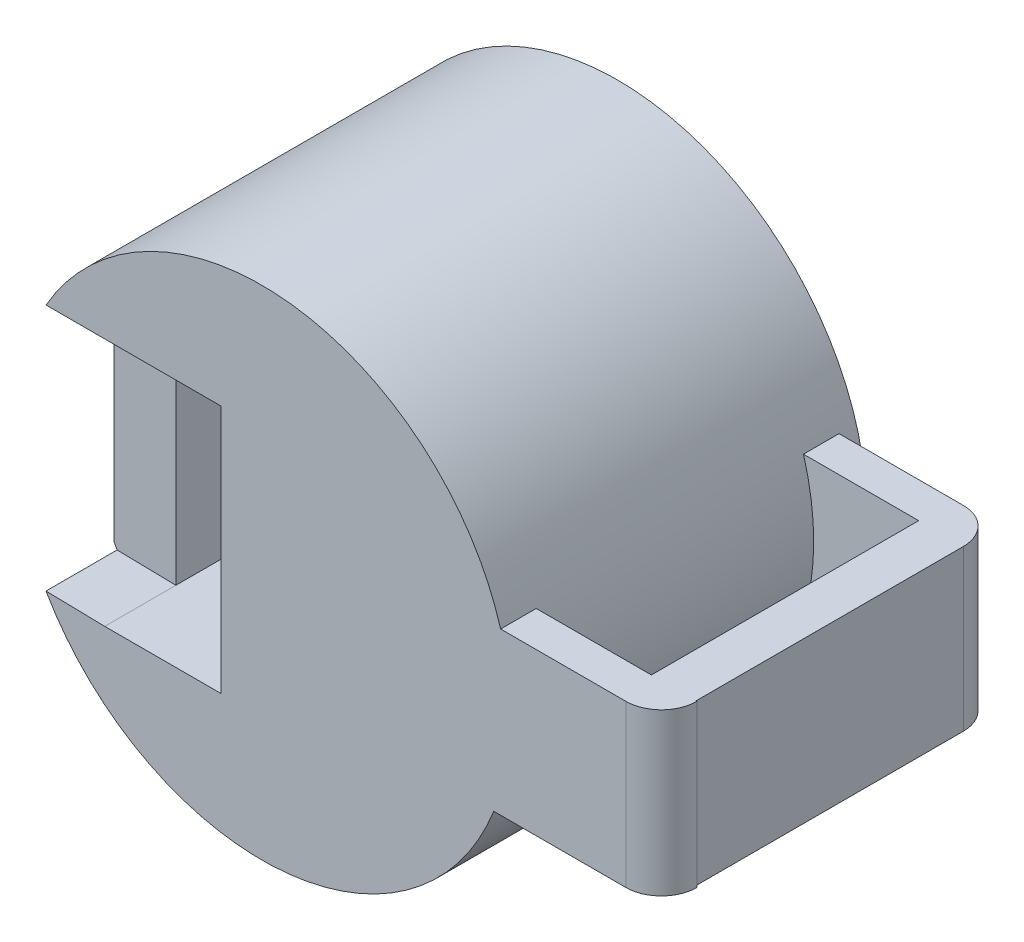
ISO-10303-21;
HEADER;
FILE_DESCRIPTION(('STEP AP214'),'2;1');
FILE_NAME('part.step','',(''),(''),'','','');
FILE_SCHEMA(('AUTOMOTIVE_DESIGN { 1 0 10303 214 1 1 1 1 }'));
ENDSEC;
DATA;
#1=APPLICATION_CONTEXT('core data for automotive mechanical design processes');
#2=APPLICATION_PROTOCOL_DEFINITION('international standard','automotive_design',2000,#1);
#3=PRODUCT_CONTEXT('',#1,'mechanical');
#4=PRODUCT('Part','Part','',(#3));
#5=PRODUCT_RELATED_PRODUCT_CATEGORY('part','',(#4));
#6=PRODUCT_DEFINITION_FORMATION('','',#4);
#7=PRODUCT_DEFINITION_CONTEXT('part definition',#1,'design');
#8=PRODUCT_DEFINITION('design','',#6,#7);
#9=PRODUCT_DEFINITION_SHAPE('','',#8);
#10=(LENGTH_UNIT() NAMED_UNIT(*) SI_UNIT(.MILLI.,.METRE.));
#11=(NAMED_UNIT(*) PLANE_ANGLE_UNIT() SI_UNIT($,.RADIAN.));
#12=(NAMED_UNIT(*) SI_UNIT($,.STERADIAN.) SOLID_ANGLE_UNIT());
#13=UNCERTAINTY_MEASURE_WITH_UNIT(LENGTH_MEASURE(1.E-05),#10,'distance_accuracy_value','');
#14=(GEOMETRIC_REPRESENTATION_CONTEXT(3) GLOBAL_UNCERTAINTY_ASSIGNED_CONTEXT((#13)) GLOBAL_UNIT_ASSIGNED_CONTEXT((#10,
#11,#12)) REPRESENTATION_CONTEXT('',''));
#15=CARTESIAN_POINT('',(0.,0.,0.));
#16=DIRECTION('',(0.,0.,1.));
#17=DIRECTION('',(1.,0.,0.));
#18=AXIS2_PLACEMENT_3D('',#15,#16,#17);
#19=CARTESIAN_POINT('',(-79.6322827842628,6.03259849026327,0.));
#20=DIRECTION('',(-1.,0.,0.));
#21=DIRECTION('',(0.,0.,1.));
#22=AXIS2_PLACEMENT_3D('',#19,#20,#21);
#23=PLANE('',#22);
#24=DIRECTION('',(0.,0.,1.));
#25=VECTOR('',#24,1.);
#26=CARTESIAN_POINT('',(-79.6322827842628,-0.967401509736732,0.));
#27=LINE('',#26,#25);
#28=CARTESIAN_POINT('',(-79.6322827842628,-0.967401509736732,2.));
#29=VERTEX_POINT('',#28);
#30=CARTESIAN_POINT('',(-79.6322827842628,-0.967401509736732,8.));
#31=VERTEX_POINT('',#30);
#32=EDGE_CURVE('E259',#29,#31,#27,.T.);
#33=ORIENTED_EDGE('',*,*,#32,.F.);
#34=DIRECTION('',(0.,-1.,0.));
#35=VECTOR('',#34,1.);
#36=CARTESIAN_POINT('',(-79.6322827842628,-0.967401509736732,2.));
#37=LINE('',#36,#35);
#38=CARTESIAN_POINT('',(-79.6322827842628,6.03259849026327,2.));
#39=VERTEX_POINT('',#38);
#40=EDGE_CURVE('E57',#39,#29,#37,.T.);
#41=ORIENTED_EDGE('',*,*,#40,.F.);
#42=DIRECTION('',(0.,0.,1.));
#43=VECTOR('',#42,1.);
#44=CARTESIAN_POINT('',(-79.6322827842628,6.03259849026327,0.));
#45=LINE('',#44,#43);
#46=CARTESIAN_POINT('',(-79.6322827842628,6.03259849026327,8.));
#47=VERTEX_POINT('',#46);
#48=EDGE_CURVE('E250',#39,#47,#45,.T.);
#49=ORIENTED_EDGE('',*,*,#48,.T.);
#50=DIRECTION('',(0.,1.,0.));
#51=VECTOR('',#50,1.);
#52=CARTESIAN_POINT('',(-79.6322827842628,-0.967401509736732,8.));
#53=LINE('',#52,#51);
#54=EDGE_CURVE('E220',#31,#47,#53,.T.);
#55=ORIENTED_EDGE('',*,*,#54,.F.);
#56=EDGE_LOOP('',(#33,#41,#49,#55));
#57=FACE_BOUND('',#56,.T.);
#58=ADVANCED_FACE('F35',(#57),#23,.F.);
#59=CARTESIAN_POINT('',(-75.2117108329897,2.55000000000001,10.));
#60=DIRECTION('',(0.,0.,1.));
#61=DIRECTION('',(1.,0.,0.));
#62=AXIS2_PLACEMENT_3D('',#59,#60,#61);
#63=PLANE('',#62);
#64=DIRECTION('',(0.999778058097927,-0.0210673810887485,0.));
#65=VECTOR('',#64,1.);
#66=CARTESIAN_POINT('',(-81.2839021800748,-0.932598490263252,10.));
#67=LINE('',#66,#65);
#68=CARTESIAN_POINT('',(-81.2839021800748,-0.932598490263249,10.));
#69=VERTEX_POINT('',#68);
#70=CARTESIAN_POINT('',(-79.6322827842628,-0.967401509736732,10.));
#71=VERTEX_POINT('',#70);
#72=EDGE_CURVE('E218',#69,#71,#67,.T.);
#73=ORIENTED_EDGE('',*,*,#72,.F.);
#74=CARTESIAN_POINT('',(-75.2117108329897,2.55000000000001,10.));
#75=DIRECTION('',(0.,0.,1.));
#76=DIRECTION('',(1.,0.,0.));
#77=AXIS2_PLACEMENT_3D('',#74,#75,#76);
#78=CIRCLE('',#77,7.);
#79=CARTESIAN_POINT('',(-68.692700171854,0.,10.));
#80=VERTEX_POINT('',#79);
#81=EDGE_CURVE('E327',#69,#80,#78,.T.);
#82=ORIENTED_EDGE('',*,*,#81,.T.);
#83=DIRECTION('',(1.,0.,0.));
#84=VECTOR('',#83,1.);
#85=CARTESIAN_POINT('',(-63.9777348239475,0.,10.));
#86=LINE('',#85,#84);
#87=CARTESIAN_POINT('',(-64.9777348239475,0.,10.));
#88=VERTEX_POINT('',#87);
#89=EDGE_CURVE('E303',#80,#88,#86,.T.);
#90=ORIENTED_EDGE('',*,*,#89,.T.);
#91=DIRECTION('',(0.,1.,0.));
#92=VECTOR('',#91,1.);
#93=CARTESIAN_POINT('',(-64.9777348239475,4.534999237552,10.));
#94=LINE('',#93,#92);
#95=CARTESIAN_POINT('',(-64.9777348239475,4.534999237552,10.));
#96=VERTEX_POINT('',#95);
#97=EDGE_CURVE('E361',#88,#96,#94,.T.);
#98=ORIENTED_EDGE('',*,*,#97,.T.);
#99=DIRECTION('',(-1.,0.,0.));
#100=VECTOR('',#99,1.);
#101=CARTESIAN_POINT('',(-69.5931377068921,4.534999237552,10.));
#102=LINE('',#101,#100);
#103=CARTESIAN_POINT('',(-68.4990527881524,4.534999237552,10.));
#104=VERTEX_POINT('',#103);
#105=EDGE_CURVE('E306',#96,#104,#102,.T.);
#106=ORIENTED_EDGE('',*,*,#105,.T.);
#107=CARTESIAN_POINT('',(-81.2839021800748,6.03259849026327,10.));
#108=VERTEX_POINT('',#107);
#109=EDGE_CURVE('E323',#104,#108,#78,.T.);
#110=ORIENTED_EDGE('',*,*,#109,.T.);
#111=DIRECTION('',(1.,0.,0.));
#112=VECTOR('',#111,1.);
#113=CARTESIAN_POINT('',(-79.6322827842628,6.03259849026327,10.));
#114=LINE('',#113,#112);
#115=CARTESIAN_POINT('',(-76.3656360571261,6.03259849026327,10.));
#116=VERTEX_POINT('',#115);
#117=EDGE_CURVE('E237',#108,#116,#114,.T.);
#118=ORIENTED_EDGE('',*,*,#117,.T.);
#119=DIRECTION('',(0.,-1.,0.));
#120=VECTOR('',#119,1.);
#121=CARTESIAN_POINT('',(-76.3656360571261,6.03259849026327,10.));
#122=LINE('',#121,#120);
#123=CARTESIAN_POINT('',(-76.3656360571261,-0.967401509736732,10.));
#124=VERTEX_POINT('',#123);
#125=EDGE_CURVE('E253',#116,#124,#122,.T.);
#126=ORIENTED_EDGE('',*,*,#125,.T.);
#127=DIRECTION('',(1.,0.,0.));
#128=VECTOR('',#127,1.);
#129=CARTESIAN_POINT('',(-79.6322827842628,-0.967401509736732,10.));
#130=LINE('',#129,#128);
#131=EDGE_CURVE('E245',#71,#124,#130,.T.);
#132=ORIENTED_EDGE('',*,*,#131,.F.);
#133=EDGE_LOOP('',(#73,#82,#90,#98,#106,#110,#118,#126,#132));
#134=FACE_BOUND('',#133,.T.);
#135=ADVANCED_FACE('F375',(#134),#63,.T.);
#136=CARTESIAN_POINT('',(-75.2117108329897,2.55000000000001,0.));
#137=DIRECTION('',(0.,0.,1.));
#138=DIRECTION('',(1.,0.,0.));
#139=AXIS2_PLACEMENT_3D('',#136,#137,#138);
#140=PLANE('',#139);
#141=DIRECTION('',(1.,0.,0.));
#142=VECTOR('',#141,1.);
#143=CARTESIAN_POINT('',(-79.6322827842628,6.03259849026327,0.));
#144=LINE('',#143,#142);
#145=CARTESIAN_POINT('',(-81.2839021800748,6.03259849026327,0.));
#146=VERTEX_POINT('',#145);
#147=CARTESIAN_POINT('',(-76.3656360571261,6.03259849026327,0.));
#148=VERTEX_POINT('',#147);
#149=EDGE_CURVE('E242',#146,#148,#144,.T.);
#150=ORIENTED_EDGE('',*,*,#149,.F.);
#151=CARTESIAN_POINT('',(-75.2117108329897,2.55000000000001,0.));
#152=DIRECTION('',(0.,0.,1.));
#153=DIRECTION('',(1.,0.,0.));
#154=AXIS2_PLACEMENT_3D('',#151,#152,#153);
#155=CIRCLE('',#154,7.);
#156=CARTESIAN_POINT('',(-81.2839021800748,-0.932598490263241,0.));
#157=VERTEX_POINT('',#156);
#158=EDGE_CURVE('E322',#157,#146,#155,.T.);
#159=ORIENTED_EDGE('',*,*,#158,.F.);
#160=DIRECTION('',(-0.999778058097927,0.0210673810887533,0.));
#161=VECTOR('',#160,1.);
#162=CARTESIAN_POINT('',(-81.2839021800748,-0.932598490263243,0.));
#163=LINE('',#162,#161);
#164=CARTESIAN_POINT('',(-79.6322827842628,-0.967401509736732,0.));
#165=VERTEX_POINT('',#164);
#166=EDGE_CURVE('E202',#165,#157,#163,.T.);
#167=ORIENTED_EDGE('',*,*,#166,.F.);
#168=DIRECTION('',(1.,0.,0.));
#169=VECTOR('',#168,1.);
#170=CARTESIAN_POINT('',(-79.6322827842628,-0.967401509736732,0.));
#171=LINE('',#170,#169);
#172=CARTESIAN_POINT('',(-76.3656360571261,-0.967401509736732,0.));
#173=VERTEX_POINT('',#172);
#174=EDGE_CURVE('E247',#165,#173,#171,.T.);
#175=ORIENTED_EDGE('',*,*,#174,.T.);
#176=DIRECTION('',(0.,-1.,0.));
#177=VECTOR('',#176,1.);
#178=CARTESIAN_POINT('',(-76.3656360571261,6.03259849026327,0.));
#179=LINE('',#178,#177);
#180=EDGE_CURVE('E244',#148,#173,#179,.T.);
#181=ORIENTED_EDGE('',*,*,#180,.F.);
#182=EDGE_LOOP('',(#150,#159,#167,#175,#181));
#183=FACE_BOUND('',#182,.T.);
#184=ADVANCED_FACE('F427',(#183),#140,.F.);
#185=CARTESIAN_POINT('',(-65.2601105072329,0.,0.));
#186=DIRECTION('',(1.,0.,0.));
#187=DIRECTION('',(0.,0.,-1.));
#188=AXIS2_PLACEMENT_3D('',#185,#186,#187);
#189=PLANE('',#188);
#190=DIRECTION('',(0.,-1.,0.));
#191=VECTOR('',#190,1.);
#192=CARTESIAN_POINT('',(-65.2601105072329,4.534999237552,0.484260169593148));
#193=LINE('',#192,#191);
#194=CARTESIAN_POINT('',(-65.2601105072329,0.0349992375519997,0.484260169593148));
#195=VERTEX_POINT('',#194);
#196=CARTESIAN_POINT('',(-65.2601105072329,0.,0.484260169593148));
#197=VERTEX_POINT('',#196);
#198=EDGE_CURVE('E279',#195,#197,#193,.T.);
#199=ORIENTED_EDGE('',*,*,#198,.F.);
#200=DIRECTION('',(0.,0.,1.));
#201=VECTOR('',#200,1.);
#202=CARTESIAN_POINT('',(-65.2601105072329,0.0349992375519997,0.484260169593148));
#203=LINE('',#202,#201);
#204=CARTESIAN_POINT('',(-65.2601105072329,0.0349992375519997,1.48364750860179));
#205=VERTEX_POINT('',#204);
#206=EDGE_CURVE('E276',#195,#205,#203,.T.);
#207=ORIENTED_EDGE('',*,*,#206,.T.);
#208=DIRECTION('',(0.,0.0349992375519997,0.999387339008644));
#209=VECTOR('',#208,1.);
#210=CARTESIAN_POINT('',(-65.2601105072329,0.0349992375519997,1.48364750860179));
#211=LINE('',#210,#209);
#212=EDGE_CURVE('E284',#197,#205,#211,.T.);
#213=ORIENTED_EDGE('',*,*,#212,.F.);
#214=EDGE_LOOP('',(#199,#207,#213));
#215=FACE_BOUND('',#214,.T.);
#216=ADVANCED_FACE('F469',(#215),#189,.T.);
#217=CARTESIAN_POINT('',(-75.2117108329897,2.55000000000001,10.));
#218=DIRECTION('',(0.,0.,-1.));
#219=DIRECTION('',(-1.,0.,0.));
#220=AXIS2_PLACEMENT_3D('',#217,#218,#219);
#221=CYLINDRICAL_SURFACE('',#220,7.);
#222=CARTESIAN_POINT('',(-75.2117108329897,2.55000000000001,8.));
#223=DIRECTION('',(0.,0.,1.));
#224=DIRECTION('',(1.,0.,0.));
#225=AXIS2_PLACEMENT_3D('',#222,#223,#224);
#226=CIRCLE('',#225,6.99999999999998);
#227=CARTESIAN_POINT('',(-81.3656360571261,-0.786046213069779,8.));
#228=VERTEX_POINT('',#227);
#229=CARTESIAN_POINT('',(-81.2839021800748,-0.932598490263249,8.));
#230=VERTEX_POINT('',#229);
#231=EDGE_CURVE('E201',#228,#230,#226,.T.);
#232=ORIENTED_EDGE('',*,*,#231,.F.);
#233=DIRECTION('',(0.,0.,-1.));
#234=VECTOR('',#233,1.);
#235=CARTESIAN_POINT('',(-81.3656360571261,-0.786046213069784,10.));
#236=LINE('',#235,#234);
#237=CARTESIAN_POINT('',(-81.3656360571261,-0.786046213069791,2.));
#238=VERTEX_POINT('',#237);
#239=EDGE_CURVE('E189',#228,#238,#236,.T.);
#240=ORIENTED_EDGE('',*,*,#239,.T.);
#241=CARTESIAN_POINT('',(-75.2117108329895,2.55000000000001,2.));
#242=DIRECTION('',(0.,0.,-1.));
#243=DIRECTION('',(1.,0.,0.));
#244=AXIS2_PLACEMENT_3D('',#241,#242,#243);
#245=CIRCLE('',#244,7.00000000000013);
#246=CARTESIAN_POINT('',(-81.2839021800748,-0.932598490263241,2.));
#247=VERTEX_POINT('',#246);
#248=EDGE_CURVE('E199',#247,#238,#245,.T.);
#249=ORIENTED_EDGE('',*,*,#248,.F.);
#250=DIRECTION('',(0.,0.,-1.));
#251=VECTOR('',#250,1.);
#252=CARTESIAN_POINT('',(-81.2839021800748,-0.932598490263241,2.));
#253=LINE('',#252,#251);
#254=EDGE_CURVE('E209',#247,#157,#253,.T.);
#255=ORIENTED_EDGE('',*,*,#254,.T.);
#256=ORIENTED_EDGE('',*,*,#158,.T.);
#257=DIRECTION('',(0.,0.,-1.));
#258=VECTOR('',#257,1.);
#259=CARTESIAN_POINT('',(-81.2839021800748,6.03259849026327,2.));
#260=LINE('',#259,#258);
#261=CARTESIAN_POINT('',(-81.2839021800748,6.03259849026327,2.));
#262=VERTEX_POINT('',#261);
#263=EDGE_CURVE('E215',#262,#146,#260,.T.);
#264=ORIENTED_EDGE('',*,*,#263,.F.);
#265=CARTESIAN_POINT('',(-81.3656360571261,5.88604621306982,2.));
#266=VERTEX_POINT('',#265);
#267=EDGE_CURVE('E207',#266,#262,#245,.T.);
#268=ORIENTED_EDGE('',*,*,#267,.F.);
#269=DIRECTION('',(0.,0.,-1.));
#270=VECTOR('',#269,1.);
#271=CARTESIAN_POINT('',(-81.3656360571261,5.88604621306981,10.));
#272=LINE('',#271,#270);
#273=CARTESIAN_POINT('',(-81.3656360571261,5.8860462130698,8.));
#274=VERTEX_POINT('',#273);
#275=EDGE_CURVE('E50',#266,#274,#272,.F.);
#276=ORIENTED_EDGE('',*,*,#275,.T.);
#277=CARTESIAN_POINT('',(-81.2839021800748,6.03259849026327,8.));
#278=VERTEX_POINT('',#277);
#279=EDGE_CURVE('E226',#278,#274,#226,.T.);
#280=ORIENTED_EDGE('',*,*,#279,.F.);
#281=DIRECTION('',(0.,0.,1.));
#282=VECTOR('',#281,1.);
#283=CARTESIAN_POINT('',(-81.2839021800748,6.03259849026327,8.));
#284=LINE('',#283,#282);
#285=EDGE_CURVE('E232',#278,#108,#284,.T.);
#286=ORIENTED_EDGE('',*,*,#285,.T.);
#287=ORIENTED_EDGE('',*,*,#109,.F.);
#288=DIRECTION('',(0.,0.,-1.));
#289=VECTOR('',#288,1.);
#290=CARTESIAN_POINT('',(-68.4990527881524,4.534999237552,10.));
#291=LINE('',#290,#289);
#292=CARTESIAN_POINT('',(-68.4990527881524,4.534999237552,9.));
#293=VERTEX_POINT('',#292);
#294=EDGE_CURVE('E309',#293,#104,#291,.F.);
#295=ORIENTED_EDGE('',*,*,#294,.F.);
#296=CARTESIAN_POINT('',(-75.2117108329897,2.55000000000001,9.));
#297=DIRECTION('',(0.,0.,-1.));
#298=DIRECTION('',(-1.,0.,0.));
#299=AXIS2_PLACEMENT_3D('',#296,#297,#298);
#300=CIRCLE('',#299,7.);
#301=CARTESIAN_POINT('',(-68.692700171854,0.,9.));
#302=VERTEX_POINT('',#301);
#303=EDGE_CURVE('E326',#293,#302,#300,.T.);
#304=ORIENTED_EDGE('',*,*,#303,.T.);
#305=DIRECTION('',(0.,0.,-1.));
#306=VECTOR('',#305,1.);
#307=CARTESIAN_POINT('',(-68.692700171854,0.,10.));
#308=LINE('',#307,#306);
#309=EDGE_CURVE('E319',#80,#302,#308,.T.);
#310=ORIENTED_EDGE('',*,*,#309,.F.);
#311=ORIENTED_EDGE('',*,*,#81,.F.);
#312=DIRECTION('',(0.,0.,1.));
#313=VECTOR('',#312,1.);
#314=CARTESIAN_POINT('',(-81.2839021800748,-0.932598490263249,8.));
#315=LINE('',#314,#313);
#316=EDGE_CURVE('E238',#230,#69,#315,.T.);
#317=ORIENTED_EDGE('',*,*,#316,.F.);
#318=EDGE_LOOP('',(#232,#240,#249,#255,#256,#264,#268,#276,#280,#286,#287,#295,#304,#310,#311,#317));
#319=FACE_BOUND('',#318,.T.);
#320=DIRECTION('',(0.,0.,-1.));
#321=VECTOR('',#320,1.);
#322=CARTESIAN_POINT('',(-68.4990527881524,4.534999237552,10.));
#323=LINE('',#322,#321);
#324=CARTESIAN_POINT('',(-68.4990527881524,4.534999237552,0.484260169593147));
#325=VERTEX_POINT('',#324);
#326=CARTESIAN_POINT('',(-68.4990527881524,4.534999237552,1.48364750860179));
#327=VERTEX_POINT('',#326);
#328=EDGE_CURVE('E341',#325,#327,#323,.F.);
#329=ORIENTED_EDGE('',*,*,#328,.F.);
#330=CARTESIAN_POINT('',(-75.2117108329897,2.55000000000001,0.484260169593147));
#331=DIRECTION('',(0.,0.,1.));
#332=DIRECTION('',(1.,0.,0.));
#333=AXIS2_PLACEMENT_3D('',#330,#331,#332);
#334=CIRCLE('',#333,7.);
#335=CARTESIAN_POINT('',(-68.692700171854,0.,0.484260169593148));
#336=VERTEX_POINT('',#335);
#337=EDGE_CURVE('E338',#336,#325,#334,.T.);
#338=ORIENTED_EDGE('',*,*,#337,.F.);
#339=CARTESIAN_POINT('',(-75.2117108329897,2.55000000000001,73.2983524961972));
#340=DIRECTION('',(0.,0.999387339008644,-0.0349992375519997));
#341=DIRECTION('',(0.,-0.0349992375519997,-0.999387339008644));
#342=AXIS2_PLACEMENT_3D('',#339,#340,#341);
#343=ELLIPSE('',#342,200.004356940629,7.);
#344=CARTESIAN_POINT('',(-68.6791178436105,0.0349992375519997,1.48364750860179));
#345=VERTEX_POINT('',#344);
#346=EDGE_CURVE('E335',#345,#336,#343,.T.);
#347=ORIENTED_EDGE('',*,*,#346,.F.);
#348=CARTESIAN_POINT('',(-75.2117108329897,2.55000000000001,1.48364750860179));
#349=DIRECTION('',(0.,0.,-1.));
#350=DIRECTION('',(0.,1.,0.));
#351=AXIS2_PLACEMENT_3D('',#348,#349,#350);
#352=CIRCLE('',#351,7.);
#353=EDGE_CURVE('E332',#327,#345,#352,.T.);
#354=ORIENTED_EDGE('',*,*,#353,.F.);
#355=EDGE_LOOP('',(#329,#338,#347,#354));
#356=FACE_BOUND('',#355,.T.);
#357=ADVANCED_FACE('F196',(#319,#356),#221,.T.);
#358=CARTESIAN_POINT('',(-63.9777348239475,0.,10.));
#359=DIRECTION('',(0.,1.,0.));
#360=DIRECTION('',(0.,0.,1.));
#361=AXIS2_PLACEMENT_3D('',#358,#359,#360);
#362=PLANE('',#361);
#363=DIRECTION('',(1.,0.,0.));
#364=VECTOR('',#363,1.);
#365=CARTESIAN_POINT('',(-63.9777348239475,0.,9.));
#366=LINE('',#365,#364);
#367=CARTESIAN_POINT('',(-63.9777348239475,0.,9.));
#368=VERTEX_POINT('',#367);
#369=EDGE_CURVE('E302',#302,#368,#366,.T.);
#370=ORIENTED_EDGE('',*,*,#369,.T.);
#371=CARTESIAN_POINT('',(-64.9777348239475,0.,9.));
#372=DIRECTION('',(0.,1.,0.));
#373=DIRECTION('',(0.,0.,1.));
#374=AXIS2_PLACEMENT_3D('',#371,#372,#373);
#375=CIRCLE('',#374,1.);
#376=EDGE_CURVE('E43',#368,#88,#375,.F.);
#377=ORIENTED_EDGE('',*,*,#376,.T.);
#378=ORIENTED_EDGE('',*,*,#89,.F.);
#379=ORIENTED_EDGE('',*,*,#309,.T.);
#380=EDGE_LOOP('',(#370,#377,#378,#379));
#381=FACE_BOUND('',#380,.T.);
#382=ADVANCED_FACE('F368',(#381),#362,.F.);
#383=CARTESIAN_POINT('',(-69.5931377068921,4.534999237552,10.));
#384=DIRECTION('',(0.,-1.,0.));
#385=DIRECTION('',(0.,0.,-1.));
#386=AXIS2_PLACEMENT_3D('',#383,#384,#385);
#387=PLANE('',#386);
#388=ORIENTED_EDGE('',*,*,#105,.F.);
#389=CARTESIAN_POINT('',(-64.9777348239475,4.534999237552,9.));
#390=DIRECTION('',(0.,-1.,0.));
#391=DIRECTION('',(0.,0.,-1.));
#392=AXIS2_PLACEMENT_3D('',#389,#390,#391);
#393=CIRCLE('',#392,1.);
#394=CARTESIAN_POINT('',(-63.9777348239475,4.534999237552,9.));
#395=VERTEX_POINT('',#394);
#396=EDGE_CURVE('E364',#96,#395,#393,.F.);
#397=ORIENTED_EDGE('',*,*,#396,.T.);
#398=DIRECTION('',(-1.,0.,0.));
#399=VECTOR('',#398,1.);
#400=CARTESIAN_POINT('',(-69.5931377068921,4.534999237552,9.));
#401=LINE('',#400,#399);
#402=CARTESIAN_POINT('',(-64.0024569689168,4.534999237552,9.));
#403=VERTEX_POINT('',#402);
#404=EDGE_CURVE('E307',#395,#403,#401,.T.);
#405=ORIENTED_EDGE('',*,*,#404,.T.);
#406=DIRECTION('',(0.,0.,-1.));
#407=VECTOR('',#406,1.);
#408=CARTESIAN_POINT('',(-64.0024569689168,4.534999237552,9.48426016959315));
#409=LINE('',#408,#407);
#410=CARTESIAN_POINT('',(-64.0024569689168,4.534999237552,1.48426016959315));
#411=VERTEX_POINT('',#410);
#412=EDGE_CURVE('E268',#403,#411,#409,.T.);
#413=ORIENTED_EDGE('',*,*,#412,.T.);
#414=CARTESIAN_POINT('',(-65.0024569689168,4.534999237552,1.48426016959315));
#415=DIRECTION('',(0.,-1.,0.));
#416=DIRECTION('',(0.,0.,-1.));
#417=AXIS2_PLACEMENT_3D('',#414,#415,#416);
#418=CIRCLE('',#417,1.);
#419=CARTESIAN_POINT('',(-65.0024569689168,4.534999237552,0.484260169593148));
#420=VERTEX_POINT('',#419);
#421=EDGE_CURVE('E355',#411,#420,#418,.F.);
#422=ORIENTED_EDGE('',*,*,#421,.T.);
#423=DIRECTION('',(1.,0.,0.));
#424=VECTOR('',#423,1.);
#425=CARTESIAN_POINT('',(-71.2601105072329,4.534999237552,0.484260169593148));
#426=LINE('',#425,#424);
#427=EDGE_CURVE('E299',#325,#420,#426,.T.);
#428=ORIENTED_EDGE('',*,*,#427,.F.);
#429=ORIENTED_EDGE('',*,*,#328,.T.);
#430=DIRECTION('',(1.,0.,0.));
#431=VECTOR('',#430,1.);
#432=CARTESIAN_POINT('',(-71.2601105072329,4.534999237552,1.48364750860179));
#433=LINE('',#432,#431);
#434=CARTESIAN_POINT('',(-65.2601105072329,4.534999237552,1.48364750860179));
#435=VERTEX_POINT('',#434);
#436=EDGE_CURVE('E290',#327,#435,#433,.T.);
#437=ORIENTED_EDGE('',*,*,#436,.T.);
#438=DIRECTION('',(0.,0.,1.));
#439=VECTOR('',#438,1.);
#440=CARTESIAN_POINT('',(-65.2601105072329,4.534999237552,0.484260169593148));
#441=LINE('',#440,#439);
#442=CARTESIAN_POINT('',(-65.2601105072329,4.534999237552,9.));
#443=VERTEX_POINT('',#442);
#444=EDGE_CURVE('E273',#435,#443,#441,.T.);
#445=ORIENTED_EDGE('',*,*,#444,.T.);
#446=EDGE_CURVE('E314',#443,#293,#401,.T.);
#447=ORIENTED_EDGE('',*,*,#446,.T.);
#448=ORIENTED_EDGE('',*,*,#294,.T.);
#449=EDGE_LOOP('',(#388,#397,#405,#413,#422,#428,#429,#437,#445,#447,#448));
#450=FACE_BOUND('',#449,.T.);
#451=ADVANCED_FACE('F380',(#450),#387,.F.);
#452=CARTESIAN_POINT('',(0.,0.,9.));
#453=DIRECTION('',(0.,0.,-1.));
#454=DIRECTION('',(-1.,0.,0.));
#455=AXIS2_PLACEMENT_3D('',#452,#453,#454);
#456=PLANE('',#455);
#457=DIRECTION('',(0.,1.,0.));
#458=VECTOR('',#457,1.);
#459=CARTESIAN_POINT('',(-65.2601105072329,0.,9.));
#460=LINE('',#459,#458);
#461=CARTESIAN_POINT('',(-65.2601105072329,0.0349992375519997,9.));
#462=VERTEX_POINT('',#461);
#463=EDGE_CURVE('E349',#462,#443,#460,.T.);
#464=ORIENTED_EDGE('',*,*,#463,.F.);
#465=DIRECTION('',(1.,0.,0.));
#466=VECTOR('',#465,1.);
#467=CARTESIAN_POINT('',(0.,0.0349992375519997,9.));
#468=LINE('',#467,#466);
#469=CARTESIAN_POINT('',(-64.0024569689168,0.0349992375519997,9.));
#470=VERTEX_POINT('',#469);
#471=EDGE_CURVE('E344',#462,#470,#468,.T.);
#472=ORIENTED_EDGE('',*,*,#471,.T.);
#473=DIRECTION('',(0.,-1.,0.));
#474=VECTOR('',#473,1.);
#475=CARTESIAN_POINT('',(-64.0024569689168,0.,9.));
#476=LINE('',#475,#474);
#477=EDGE_CURVE('E347',#403,#470,#476,.T.);
#478=ORIENTED_EDGE('',*,*,#477,.F.);
#479=ORIENTED_EDGE('',*,*,#404,.F.);
#480=DIRECTION('',(0.,1.,0.));
#481=VECTOR('',#480,1.);
#482=CARTESIAN_POINT('',(-63.9777348239475,4.534999237552,9.));
#483=LINE('',#482,#481);
#484=EDGE_CURVE('E311',#368,#395,#483,.T.);
#485=ORIENTED_EDGE('',*,*,#484,.F.);
#486=ORIENTED_EDGE('',*,*,#369,.F.);
#487=ORIENTED_EDGE('',*,*,#303,.F.);
#488=ORIENTED_EDGE('',*,*,#446,.F.);
#489=EDGE_LOOP('',(#464,#472,#478,#479,#485,#486,#487,#488));
#490=FACE_BOUND('',#489,.T.);
#491=ADVANCED_FACE('F384',(#490),#456,.T.);
#492=CARTESIAN_POINT('',(-71.2601105072329,4.534999237552,0.484260169593148));
#493=DIRECTION('',(0.,0.,1.));
#494=DIRECTION('',(1.,0.,0.));
#495=AXIS2_PLACEMENT_3D('',#492,#493,#494);
#496=PLANE('',#495);
#497=ORIENTED_EDGE('',*,*,#427,.T.);
#498=DIRECTION('',(0.,1.,0.));
#499=VECTOR('',#498,1.);
#500=CARTESIAN_POINT('',(-65.0024569689168,0.0349992375519997,0.484260169593148));
#501=LINE('',#500,#499);
#502=CARTESIAN_POINT('',(-65.0024569689168,0.0349992375519997,0.484260169593148));
#503=VERTEX_POINT('',#502);
#504=EDGE_CURVE('E357',#420,#503,#501,.F.);
#505=ORIENTED_EDGE('',*,*,#504,.T.);
#506=DIRECTION('',(-1.,0.,0.));
#507=VECTOR('',#506,1.);
#508=CARTESIAN_POINT('',(-64.0024569689168,0.0349992375519997,0.484260169593148));
#509=LINE('',#508,#507);
#510=EDGE_CURVE('E272',#503,#195,#509,.T.);
#511=ORIENTED_EDGE('',*,*,#510,.T.);
#512=ORIENTED_EDGE('',*,*,#198,.T.);
#513=DIRECTION('',(1.,0.,0.));
#514=VECTOR('',#513,1.);
#515=CARTESIAN_POINT('',(-71.2601105072329,0.,0.484260169593148));
#516=LINE('',#515,#514);
#517=EDGE_CURVE('E296',#336,#197,#516,.T.);
#518=ORIENTED_EDGE('',*,*,#517,.F.);
#519=ORIENTED_EDGE('',*,*,#337,.T.);
#520=EDGE_LOOP('',(#497,#505,#511,#512,#518,#519));
#521=FACE_BOUND('',#520,.T.);
#522=ADVANCED_FACE('F400',(#521),#496,.F.);
#523=CARTESIAN_POINT('',(-71.2601105072329,0.0349992375519997,1.48364750860179));
#524=DIRECTION('',(0.,0.999387339008644,-0.0349992375519997));
#525=DIRECTION('',(0.,0.0349992375519997,0.999387339008644));
#526=AXIS2_PLACEMENT_3D('',#523,#524,#525);
#527=PLANE('',#526);
#528=DIRECTION('',(1.,0.,0.));
#529=VECTOR('',#528,1.);
#530=CARTESIAN_POINT('',(-71.2601105072329,0.0349992375519997,1.48364750860179));
#531=LINE('',#530,#529);
#532=EDGE_CURVE('E293',#345,#205,#531,.T.);
#533=ORIENTED_EDGE('',*,*,#532,.F.);
#534=ORIENTED_EDGE('',*,*,#346,.T.);
#535=ORIENTED_EDGE('',*,*,#517,.T.);
#536=ORIENTED_EDGE('',*,*,#212,.T.);
#537=EDGE_LOOP('',(#533,#534,#535,#536));
#538=FACE_BOUND('',#537,.T.);
#539=ADVANCED_FACE('F404',(#538),#527,.F.);
#540=CARTESIAN_POINT('',(-71.2601105072329,4.534999237552,1.48364750860179));
#541=DIRECTION('',(0.,0.,-1.));
#542=DIRECTION('',(0.,1.,0.));
#543=AXIS2_PLACEMENT_3D('',#540,#541,#542);
#544=PLANE('',#543);
#545=ORIENTED_EDGE('',*,*,#436,.F.);
#546=ORIENTED_EDGE('',*,*,#353,.T.);
#547=ORIENTED_EDGE('',*,*,#532,.T.);
#548=DIRECTION('',(0.,1.,0.));
#549=VECTOR('',#548,1.);
#550=CARTESIAN_POINT('',(-65.2601105072329,4.534999237552,1.48364750860179));
#551=LINE('',#550,#549);
#552=EDGE_CURVE('E287',#205,#435,#551,.T.);
#553=ORIENTED_EDGE('',*,*,#552,.T.);
#554=EDGE_LOOP('',(#545,#546,#547,#553));
#555=FACE_BOUND('',#554,.T.);
#556=ADVANCED_FACE('F408',(#555),#544,.F.);
#557=CARTESIAN_POINT('',(-65.2601105072329,0.0349992375519997,0.484260169593148));
#558=DIRECTION('',(-1.,0.,0.));
#559=DIRECTION('',(0.,0.,1.));
#560=AXIS2_PLACEMENT_3D('',#557,#558,#559);
#561=PLANE('',#560);
#562=ORIENTED_EDGE('',*,*,#552,.F.);
#563=EDGE_CURVE('E275',#205,#462,#203,.T.);
#564=ORIENTED_EDGE('',*,*,#563,.T.);
#565=ORIENTED_EDGE('',*,*,#463,.T.);
#566=ORIENTED_EDGE('',*,*,#444,.F.);
#567=EDGE_LOOP('',(#562,#564,#565,#566));
#568=FACE_BOUND('',#567,.T.);
#569=ADVANCED_FACE('F413',(#568),#561,.T.);
#570=CARTESIAN_POINT('',(-64.0024569689168,0.0349992375519997,9.48426016959315));
#571=DIRECTION('',(1.,0.,0.));
#572=DIRECTION('',(0.,0.,-1.));
#573=AXIS2_PLACEMENT_3D('',#570,#571,#572);
#574=PLANE('',#573);
#575=DIRECTION('',(0.,0.,-1.));
#576=VECTOR('',#575,1.);
#577=CARTESIAN_POINT('',(-64.0024569689168,0.0349992375519997,9.48426016959315));
#578=LINE('',#577,#576);
#579=CARTESIAN_POINT('',(-64.0024569689168,0.0349992375519997,1.48426016959315));
#580=VERTEX_POINT('',#579);
#581=EDGE_CURVE('E269',#470,#580,#578,.T.);
#582=ORIENTED_EDGE('',*,*,#581,.T.);
#583=DIRECTION('',(0.,1.,0.));
#584=VECTOR('',#583,1.);
#585=CARTESIAN_POINT('',(-64.0024569689168,4.534999237552,1.48426016959315));
#586=LINE('',#585,#584);
#587=EDGE_CURVE('E352',#580,#411,#586,.T.);
#588=ORIENTED_EDGE('',*,*,#587,.T.);
#589=ORIENTED_EDGE('',*,*,#412,.F.);
#590=ORIENTED_EDGE('',*,*,#477,.T.);
#591=EDGE_LOOP('',(#582,#588,#589,#590));
#592=FACE_BOUND('',#591,.T.);
#593=ADVANCED_FACE('F387',(#592),#574,.T.);
#594=CARTESIAN_POINT('',(0.,0.0349992375519997,0.));
#595=DIRECTION('',(0.,1.,0.));
#596=DIRECTION('',(0.,0.,1.));
#597=AXIS2_PLACEMENT_3D('',#594,#595,#596);
#598=PLANE('',#597);
#599=ORIENTED_EDGE('',*,*,#510,.F.);
#600=CARTESIAN_POINT('',(-65.0024569689168,0.0349992375519997,1.48426016959315));
#601=DIRECTION('',(0.,1.,0.));
#602=DIRECTION('',(0.,0.,1.));
#603=AXIS2_PLACEMENT_3D('',#600,#601,#602);
#604=CIRCLE('',#603,1.);
#605=EDGE_CURVE('E359',#503,#580,#604,.F.);
#606=ORIENTED_EDGE('',*,*,#605,.T.);
#607=ORIENTED_EDGE('',*,*,#581,.F.);
#608=ORIENTED_EDGE('',*,*,#471,.F.);
#609=ORIENTED_EDGE('',*,*,#563,.F.);
#610=ORIENTED_EDGE('',*,*,#206,.F.);
#611=EDGE_LOOP('',(#599,#606,#607,#608,#609,#610));
#612=FACE_BOUND('',#611,.T.);
#613=ADVANCED_FACE('F391',(#612),#598,.F.);
#614=CARTESIAN_POINT('',(-65.0024569689168,0.0349992375519997,1.48426016959315));
#615=DIRECTION('',(0.,-1.,0.));
#616=DIRECTION('',(0.,0.,-1.));
#617=AXIS2_PLACEMENT_3D('',#614,#615,#616);
#618=CYLINDRICAL_SURFACE('',#617,1.);
#619=ORIENTED_EDGE('',*,*,#605,.F.);
#620=ORIENTED_EDGE('',*,*,#504,.F.);
#621=ORIENTED_EDGE('',*,*,#421,.F.);
#622=ORIENTED_EDGE('',*,*,#587,.F.);
#623=EDGE_LOOP('',(#619,#620,#621,#622));
#624=FACE_BOUND('',#623,.T.);
#625=ADVANCED_FACE('F397',(#624),#618,.T.);
#626=CARTESIAN_POINT('',(-64.9777348239475,2.55000000000001,9.));
#627=DIRECTION('',(0.,-1.,0.));
#628=DIRECTION('',(0.,0.,-1.));
#629=AXIS2_PLACEMENT_3D('',#626,#627,#628);
#630=CYLINDRICAL_SURFACE('',#629,1.);
#631=ORIENTED_EDGE('',*,*,#376,.F.);
#632=ORIENTED_EDGE('',*,*,#484,.T.);
#633=ORIENTED_EDGE('',*,*,#396,.F.);
#634=ORIENTED_EDGE('',*,*,#97,.F.);
#635=EDGE_LOOP('',(#631,#632,#633,#634));
#636=FACE_BOUND('',#635,.T.);
#637=ADVANCED_FACE('F37',(#636),#630,.T.);
#638=CARTESIAN_POINT('',(-79.6322827842628,6.03259849026327,0.));
#639=DIRECTION('',(0.,-1.,0.));
#640=DIRECTION('',(0.,0.,-1.));
#641=AXIS2_PLACEMENT_3D('',#638,#639,#640);
#642=PLANE('',#641);
#643=ORIENTED_EDGE('',*,*,#117,.F.);
#644=ORIENTED_EDGE('',*,*,#285,.F.);
#645=DIRECTION('',(-1.,0.,0.));
#646=VECTOR('',#645,1.);
#647=CARTESIAN_POINT('',(-79.6322827842628,6.03259849026327,8.));
#648=LINE('',#647,#646);
#649=EDGE_CURVE('E223',#47,#278,#648,.T.);
#650=ORIENTED_EDGE('',*,*,#649,.F.);
#651=ORIENTED_EDGE('',*,*,#48,.F.);
#652=DIRECTION('',(1.,0.,0.));
#653=VECTOR('',#652,1.);
#654=CARTESIAN_POINT('',(-79.6322827842628,6.03259849026327,2.));
#655=LINE('',#654,#653);
#656=EDGE_CURVE('E206',#262,#39,#655,.T.);
#657=ORIENTED_EDGE('',*,*,#656,.F.);
#658=ORIENTED_EDGE('',*,*,#263,.T.);
#659=ORIENTED_EDGE('',*,*,#149,.T.);
#660=DIRECTION('',(0.,0.,1.));
#661=VECTOR('',#660,1.);
#662=CARTESIAN_POINT('',(-76.3656360571261,6.03259849026327,0.));
#663=LINE('',#662,#661);
#664=EDGE_CURVE('E265',#148,#116,#663,.T.);
#665=ORIENTED_EDGE('',*,*,#664,.T.);
#666=EDGE_LOOP('',(#643,#644,#650,#651,#657,#658,#659,#665));
#667=FACE_BOUND('',#666,.T.);
#668=ADVANCED_FACE('F419',(#667),#642,.T.);
#669=CARTESIAN_POINT('',(-76.3656360571261,6.03259849026327,0.));
#670=DIRECTION('',(-1.,0.,0.));
#671=DIRECTION('',(0.,0.,1.));
#672=AXIS2_PLACEMENT_3D('',#669,#670,#671);
#673=PLANE('',#672);
#674=ORIENTED_EDGE('',*,*,#125,.F.);
#675=ORIENTED_EDGE('',*,*,#664,.F.);
#676=ORIENTED_EDGE('',*,*,#180,.T.);
#677=DIRECTION('',(0.,0.,1.));
#678=VECTOR('',#677,1.);
#679=CARTESIAN_POINT('',(-76.3656360571261,-0.967401509736732,0.));
#680=LINE('',#679,#678);
#681=EDGE_CURVE('E263',#173,#124,#680,.T.);
#682=ORIENTED_EDGE('',*,*,#681,.T.);
#683=EDGE_LOOP('',(#674,#675,#676,#682));
#684=FACE_BOUND('',#683,.T.);
#685=ADVANCED_FACE('F424',(#684),#673,.T.);
#686=CARTESIAN_POINT('',(-79.6322827842628,-0.967401509736732,0.));
#687=DIRECTION('',(0.,-1.,0.));
#688=DIRECTION('',(0.,0.,-1.));
#689=AXIS2_PLACEMENT_3D('',#686,#687,#688);
#690=PLANE('',#689);
#691=ORIENTED_EDGE('',*,*,#131,.T.);
#692=ORIENTED_EDGE('',*,*,#681,.F.);
#693=ORIENTED_EDGE('',*,*,#174,.F.);
#694=EDGE_CURVE('E260',#165,#29,#27,.T.);
#695=ORIENTED_EDGE('',*,*,#694,.T.);
#696=ORIENTED_EDGE('',*,*,#32,.T.);
#697=DIRECTION('',(0.,0.,1.));
#698=VECTOR('',#697,1.);
#699=CARTESIAN_POINT('',(-79.6322827842628,-0.967401509736732,8.));
#700=LINE('',#699,#698);
#701=EDGE_CURVE('E234',#31,#71,#700,.T.);
#702=ORIENTED_EDGE('',*,*,#701,.T.);
#703=EDGE_LOOP('',(#691,#692,#693,#695,#696,#702));
#704=FACE_BOUND('',#703,.T.);
#705=ADVANCED_FACE('F432',(#704),#690,.F.);
#706=CARTESIAN_POINT('',(-81.2839021800748,-0.932598490263252,8.));
#707=DIRECTION('',(-0.0210673810887485,-0.999778058097927,0.));
#708=DIRECTION('',(0.999778058097927,-0.0210673810887485,0.));
#709=AXIS2_PLACEMENT_3D('',#706,#707,#708);
#710=PLANE('',#709);
#711=ORIENTED_EDGE('',*,*,#72,.T.);
#712=ORIENTED_EDGE('',*,*,#701,.F.);
#713=DIRECTION('',(0.999778058097927,-0.0210673810887485,0.));
#714=VECTOR('',#713,1.);
#715=CARTESIAN_POINT('',(-81.2839021800748,-0.932598490263252,8.));
#716=LINE('',#715,#714);
#717=EDGE_CURVE('E229',#230,#31,#716,.T.);
#718=ORIENTED_EDGE('',*,*,#717,.F.);
#719=ORIENTED_EDGE('',*,*,#316,.T.);
#720=EDGE_LOOP('',(#711,#712,#718,#719));
#721=FACE_BOUND('',#720,.T.);
#722=ADVANCED_FACE('F436',(#721),#710,.F.);
#723=CARTESIAN_POINT('',(-75.2117108329897,2.55000000000001,8.));
#724=DIRECTION('',(0.,0.,1.));
#725=DIRECTION('',(1.,0.,0.));
#726=AXIS2_PLACEMENT_3D('',#723,#724,#725);
#727=PLANE('',#726);
#728=DIRECTION('',(0.,1.,0.));
#729=VECTOR('',#728,1.);
#730=CARTESIAN_POINT('',(-81.3656360571261,6.03259849026327,8.));
#731=LINE('',#730,#729);
#732=EDGE_CURVE('E440',#228,#274,#731,.T.);
#733=ORIENTED_EDGE('',*,*,#732,.F.);
#734=ORIENTED_EDGE('',*,*,#231,.T.);
#735=ORIENTED_EDGE('',*,*,#717,.T.);
#736=ORIENTED_EDGE('',*,*,#54,.T.);
#737=ORIENTED_EDGE('',*,*,#649,.T.);
#738=ORIENTED_EDGE('',*,*,#279,.T.);
#739=EDGE_LOOP('',(#733,#734,#735,#736,#737,#738));
#740=FACE_BOUND('',#739,.T.);
#741=ADVANCED_FACE('F439',(#740),#727,.T.);
#742=CARTESIAN_POINT('',(-81.2839021800748,-0.932598490263243,2.));
#743=DIRECTION('',(-0.0210673810887533,-0.999778058097927,0.));
#744=DIRECTION('',(0.999778058097927,-0.0210673810887533,0.));
#745=AXIS2_PLACEMENT_3D('',#742,#743,#744);
#746=PLANE('',#745);
#747=ORIENTED_EDGE('',*,*,#166,.T.);
#748=ORIENTED_EDGE('',*,*,#254,.F.);
#749=DIRECTION('',(-0.999778058097927,0.0210673810887533,0.));
#750=VECTOR('',#749,1.);
#751=CARTESIAN_POINT('',(-81.2839021800748,-0.932598490263243,2.));
#752=LINE('',#751,#750);
#753=EDGE_CURVE('E205',#29,#247,#752,.T.);
#754=ORIENTED_EDGE('',*,*,#753,.F.);
#755=ORIENTED_EDGE('',*,*,#694,.F.);
#756=EDGE_LOOP('',(#747,#748,#754,#755));
#757=FACE_BOUND('',#756,.T.);
#758=ADVANCED_FACE('F521',(#757),#746,.F.);
#759=CARTESIAN_POINT('',(-75.2117108329895,2.55000000000001,2.));
#760=DIRECTION('',(0.,0.,1.));
#761=DIRECTION('',(1.,0.,0.));
#762=AXIS2_PLACEMENT_3D('',#759,#760,#761);
#763=PLANE('',#762);
#764=ORIENTED_EDGE('',*,*,#248,.T.);
#765=DIRECTION('',(0.,1.,0.));
#766=VECTOR('',#765,1.);
#767=CARTESIAN_POINT('',(-81.3656360571261,2.55000000000001,2.));
#768=LINE('',#767,#766);
#769=EDGE_CURVE('E11',#238,#266,#768,.T.);
#770=ORIENTED_EDGE('',*,*,#769,.T.);
#771=ORIENTED_EDGE('',*,*,#267,.T.);
#772=ORIENTED_EDGE('',*,*,#656,.T.);
#773=ORIENTED_EDGE('',*,*,#40,.T.);
#774=ORIENTED_EDGE('',*,*,#753,.T.);
#775=EDGE_LOOP('',(#764,#770,#771,#772,#773,#774));
#776=FACE_BOUND('',#775,.T.);
#777=ADVANCED_FACE('F204',(#776),#763,.F.);
#778=CARTESIAN_POINT('',(-81.3656360571261,0.,0.));
#779=DIRECTION('',(1.,0.,0.));
#780=DIRECTION('',(0.,0.,-1.));
#781=AXIS2_PLACEMENT_3D('',#778,#779,#780);
#782=PLANE('',#781);
#783=ORIENTED_EDGE('',*,*,#732,.T.);
#784=ORIENTED_EDGE('',*,*,#275,.F.);
#785=ORIENTED_EDGE('',*,*,#769,.F.);
#786=ORIENTED_EDGE('',*,*,#239,.F.);
#787=EDGE_LOOP('',(#783,#784,#785,#786));
#788=FACE_BOUND('',#787,.T.);
#789=ADVANCED_FACE('F188',(#788),#782,.F.);
#790=CLOSED_SHELL('',(#58,#135,#184,#216,#357,#382,#451,#491,#522,#539,#556,#569,#593,#613,#625,
#637,#668,#685,#705,#722,#741,#758,#777,#789));
#791=MANIFOLD_SOLID_BREP('B2',#790);
#792=ADVANCED_BREP_SHAPE_REPRESENTATION('',(#18,#791),#14);
#793=SHAPE_DEFINITION_REPRESENTATION(#9,#792);
ENDSEC;
END-ISO-10303-21;
